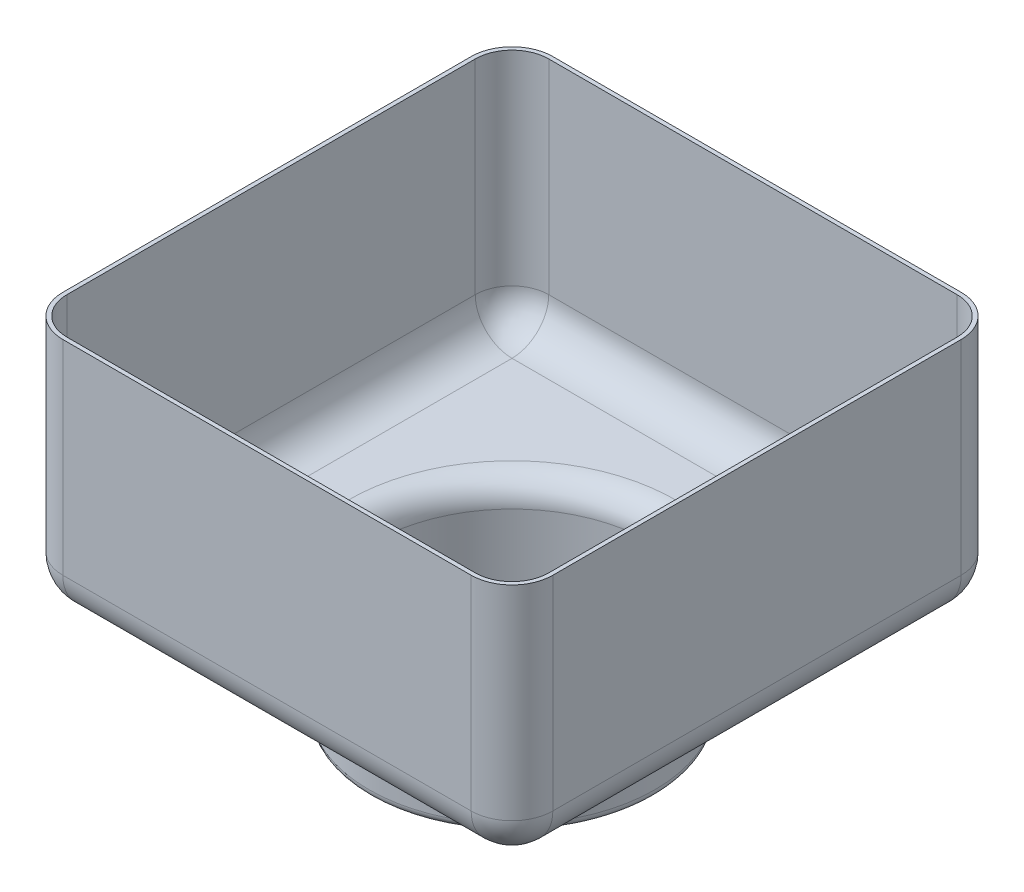
ISO-10303-21;
HEADER;
FILE_DESCRIPTION(('STEP AP214'),'2;1');
FILE_NAME('part.step','',(''),(''),'','','');
FILE_SCHEMA(('AUTOMOTIVE_DESIGN { 1 0 10303 214 1 1 1 1 }'));
ENDSEC;
DATA;
#1=APPLICATION_CONTEXT('core data for automotive mechanical design processes');
#2=APPLICATION_PROTOCOL_DEFINITION('international standard','automotive_design',2000,#1);
#3=PRODUCT_CONTEXT('',#1,'mechanical');
#4=PRODUCT('Part','Part','',(#3));
#5=PRODUCT_RELATED_PRODUCT_CATEGORY('part','',(#4));
#6=PRODUCT_DEFINITION_FORMATION('','',#4);
#7=PRODUCT_DEFINITION_CONTEXT('part definition',#1,'design');
#8=PRODUCT_DEFINITION('design','',#6,#7);
#9=PRODUCT_DEFINITION_SHAPE('','',#8);
#10=(LENGTH_UNIT() NAMED_UNIT(*) SI_UNIT(.MILLI.,.METRE.));
#11=(NAMED_UNIT(*) PLANE_ANGLE_UNIT() SI_UNIT($,.RADIAN.));
#12=(NAMED_UNIT(*) SI_UNIT($,.STERADIAN.) SOLID_ANGLE_UNIT());
#13=UNCERTAINTY_MEASURE_WITH_UNIT(LENGTH_MEASURE(1.E-05),#10,'distance_accuracy_value','');
#14=(GEOMETRIC_REPRESENTATION_CONTEXT(3) GLOBAL_UNCERTAINTY_ASSIGNED_CONTEXT((#13)) GLOBAL_UNIT_ASSIGNED_CONTEXT((#10,
#11,#12)) REPRESENTATION_CONTEXT('',''));
#15=CARTESIAN_POINT('',(0.,0.,0.));
#16=DIRECTION('',(0.,0.,1.));
#17=DIRECTION('',(1.,0.,0.));
#18=AXIS2_PLACEMENT_3D('',#15,#16,#17);
#19=CARTESIAN_POINT('',(-47.3492587282987,25.,4.92602728588064));
#20=DIRECTION('',(0.,-1.,0.));
#21=DIRECTION('',(0.,0.,-1.));
#22=AXIS2_PLACEMENT_3D('',#19,#20,#21);
#23=CYLINDRICAL_SURFACE('',#22,35.);
#24=CARTESIAN_POINT('',(-47.3492587282987,2.,4.92602728588064));
#25=DIRECTION('',(0.,1.,0.));
#26=DIRECTION('',(0.,0.,1.));
#27=AXIS2_PLACEMENT_3D('',#24,#25,#26);
#28=CIRCLE('',#27,35.);
#29=CARTESIAN_POINT('',(-47.3492587282987,2.,39.9260272858807));
#30=VERTEX_POINT('',#29);
#31=EDGE_CURVE('E43',#30,#30,#28,.T.);
#32=ORIENTED_EDGE('',*,*,#31,.T.);
#33=EDGE_LOOP('',(#32));
#34=FACE_BOUND('',#33,.T.);
#35=CARTESIAN_POINT('',(-47.3492587282987,20.,4.92602728588064));
#36=DIRECTION('',(0.,1.,0.));
#37=DIRECTION('',(0.,0.,1.));
#38=AXIS2_PLACEMENT_3D('',#35,#36,#37);
#39=CIRCLE('',#38,35.);
#40=CARTESIAN_POINT('',(-47.3492587282987,20.,39.9260272858807));
#41=VERTEX_POINT('',#40);
#42=EDGE_CURVE('E335',#41,#41,#39,.F.);
#43=ORIENTED_EDGE('',*,*,#42,.T.);
#44=EDGE_LOOP('',(#43));
#45=FACE_BOUND('',#44,.T.);
#46=ADVANCED_FACE('F35',(#34,#45),#23,.T.);
#47=CARTESIAN_POINT('',(0.,0.,0.));
#48=DIRECTION('',(0.,1.,0.));
#49=DIRECTION('',(0.,0.,1.));
#50=AXIS2_PLACEMENT_3D('',#47,#48,#49);
#51=PLANE('',#50);
#52=CARTESIAN_POINT('',(-47.3492587282987,0.,4.92602728588064));
#53=DIRECTION('',(0.,1.,0.));
#54=DIRECTION('',(0.,0.,1.));
#55=AXIS2_PLACEMENT_3D('',#52,#53,#54);
#56=CIRCLE('',#55,33.);
#57=CARTESIAN_POINT('',(-47.3492587282987,0.,37.9260272858806));
#58=VERTEX_POINT('',#57);
#59=EDGE_CURVE('E11',#58,#58,#56,.F.);
#60=ORIENTED_EDGE('',*,*,#59,.T.);
#61=EDGE_LOOP('',(#60));
#62=FACE_BOUND('',#61,.T.);
#63=ADVANCED_FACE('F357',(#62),#51,.F.);
#64=CARTESIAN_POINT('',(-97.3492587282987,85.,-45.0739727141194));
#65=DIRECTION('',(0.,-1.,0.));
#66=DIRECTION('',(0.,0.,-1.));
#67=AXIS2_PLACEMENT_3D('',#64,#65,#66);
#68=CYLINDRICAL_SURFACE('',#67,9.99999999999999);
#69=DIRECTION('',(0.,-1.,0.));
#70=VECTOR('',#69,1.);
#71=CARTESIAN_POINT('',(-97.3492587282986,85.,-55.0739727141194));
#72=LINE('',#71,#70);
#73=CARTESIAN_POINT('',(-97.3492587282986,85.,-55.0739727141194));
#74=VERTEX_POINT('',#73);
#75=CARTESIAN_POINT('',(-97.3492587282986,35.,-55.0739727141194));
#76=VERTEX_POINT('',#75);
#77=EDGE_CURVE('E264',#74,#76,#72,.T.);
#78=ORIENTED_EDGE('',*,*,#77,.T.);
#79=CARTESIAN_POINT('',(-97.3492587282987,35.,-45.0739727141194));
#80=DIRECTION('',(0.,-1.,0.));
#81=DIRECTION('',(0.,0.,-1.));
#82=AXIS2_PLACEMENT_3D('',#79,#80,#81);
#83=CIRCLE('',#82,9.99999999999999);
#84=CARTESIAN_POINT('',(-107.349258728299,35.,-45.0739727141193));
#85=VERTEX_POINT('',#84);
#86=EDGE_CURVE('E304',#76,#85,#83,.F.);
#87=ORIENTED_EDGE('',*,*,#86,.T.);
#88=DIRECTION('',(0.,-1.,0.));
#89=VECTOR('',#88,1.);
#90=CARTESIAN_POINT('',(-107.349258728299,85.,-45.0739727141193));
#91=LINE('',#90,#89);
#92=CARTESIAN_POINT('',(-107.349258728299,85.,-45.0739727141193));
#93=VERTEX_POINT('',#92);
#94=EDGE_CURVE('E283',#93,#85,#91,.T.);
#95=ORIENTED_EDGE('',*,*,#94,.F.);
#96=CARTESIAN_POINT('',(-97.3492587282987,85.,-45.0739727141194));
#97=DIRECTION('',(0.,1.,0.));
#98=DIRECTION('',(0.,0.,1.));
#99=AXIS2_PLACEMENT_3D('',#96,#97,#98);
#100=CIRCLE('',#99,9.99999999999999);
#101=EDGE_CURVE('E246',#74,#93,#100,.T.);
#102=ORIENTED_EDGE('',*,*,#101,.F.);
#103=EDGE_LOOP('',(#78,#87,#95,#102));
#104=FACE_BOUND('',#103,.T.);
#105=ADVANCED_FACE('F362',(#104),#68,.T.);
#106=CARTESIAN_POINT('',(-107.349258728299,85.,-45.0739727141193));
#107=DIRECTION('',(1.,0.,0.));
#108=DIRECTION('',(0.,0.,-1.));
#109=AXIS2_PLACEMENT_3D('',#106,#107,#108);
#110=PLANE('',#109);
#111=ORIENTED_EDGE('',*,*,#94,.T.);
#112=DIRECTION('',(0.,0.,1.));
#113=VECTOR('',#112,1.);
#114=CARTESIAN_POINT('',(-107.349258728299,35.,-45.0739727141193));
#115=LINE('',#114,#113);
#116=CARTESIAN_POINT('',(-107.349258728299,35.,54.9260272858806));
#117=VERTEX_POINT('',#116);
#118=EDGE_CURVE('E306',#85,#117,#115,.T.);
#119=ORIENTED_EDGE('',*,*,#118,.T.);
#120=DIRECTION('',(0.,-1.,0.));
#121=VECTOR('',#120,1.);
#122=CARTESIAN_POINT('',(-107.349258728299,85.,54.9260272858806));
#123=LINE('',#122,#121);
#124=CARTESIAN_POINT('',(-107.349258728299,85.,54.9260272858806));
#125=VERTEX_POINT('',#124);
#126=EDGE_CURVE('E280',#125,#117,#123,.T.);
#127=ORIENTED_EDGE('',*,*,#126,.F.);
#128=DIRECTION('',(0.,0.,1.));
#129=VECTOR('',#128,1.);
#130=CARTESIAN_POINT('',(-107.349258728299,85.,-45.0739727141193));
#131=LINE('',#130,#129);
#132=EDGE_CURVE('E249',#93,#125,#131,.T.);
#133=ORIENTED_EDGE('',*,*,#132,.F.);
#134=EDGE_LOOP('',(#111,#119,#127,#133));
#135=FACE_BOUND('',#134,.T.);
#136=ADVANCED_FACE('F449',(#135),#110,.F.);
#137=CARTESIAN_POINT('',(-97.3492587282987,85.,54.9260272858806));
#138=DIRECTION('',(0.,-1.,0.));
#139=DIRECTION('',(0.,0.,-1.));
#140=AXIS2_PLACEMENT_3D('',#137,#138,#139);
#141=CYLINDRICAL_SURFACE('',#140,9.99999999999999);
#142=ORIENTED_EDGE('',*,*,#126,.T.);
#143=CARTESIAN_POINT('',(-97.3492587282987,35.,54.9260272858806));
#144=DIRECTION('',(0.,-1.,0.));
#145=DIRECTION('',(0.,0.,-1.));
#146=AXIS2_PLACEMENT_3D('',#143,#144,#145);
#147=CIRCLE('',#146,9.99999999999999);
#148=CARTESIAN_POINT('',(-97.3492587282986,35.,64.9260272858806));
#149=VERTEX_POINT('',#148);
#150=EDGE_CURVE('E302',#117,#149,#147,.F.);
#151=ORIENTED_EDGE('',*,*,#150,.T.);
#152=DIRECTION('',(0.,-1.,0.));
#153=VECTOR('',#152,1.);
#154=CARTESIAN_POINT('',(-97.3492587282986,85.,64.9260272858806));
#155=LINE('',#154,#153);
#156=CARTESIAN_POINT('',(-97.3492587282986,85.,64.9260272858806));
#157=VERTEX_POINT('',#156);
#158=EDGE_CURVE('E277',#157,#149,#155,.T.);
#159=ORIENTED_EDGE('',*,*,#158,.F.);
#160=CARTESIAN_POINT('',(-97.3492587282987,85.,54.9260272858806));
#161=DIRECTION('',(0.,1.,0.));
#162=DIRECTION('',(0.,0.,1.));
#163=AXIS2_PLACEMENT_3D('',#160,#161,#162);
#164=CIRCLE('',#163,9.99999999999999);
#165=EDGE_CURVE('E252',#125,#157,#164,.T.);
#166=ORIENTED_EDGE('',*,*,#165,.F.);
#167=EDGE_LOOP('',(#142,#151,#159,#166));
#168=FACE_BOUND('',#167,.T.);
#169=ADVANCED_FACE('F446',(#168),#141,.T.);
#170=CARTESIAN_POINT('',(-97.3492587282986,85.,64.9260272858806));
#171=DIRECTION('',(0.,0.,-1.));
#172=DIRECTION('',(-1.,0.,0.));
#173=AXIS2_PLACEMENT_3D('',#170,#171,#172);
#174=PLANE('',#173);
#175=ORIENTED_EDGE('',*,*,#158,.T.);
#176=DIRECTION('',(1.,0.,0.));
#177=VECTOR('',#176,1.);
#178=CARTESIAN_POINT('',(-97.3492587282986,35.,64.9260272858806));
#179=LINE('',#178,#177);
#180=CARTESIAN_POINT('',(2.65074127170125,35.,64.9260272858807));
#181=VERTEX_POINT('',#180);
#182=EDGE_CURVE('E291',#149,#181,#179,.T.);
#183=ORIENTED_EDGE('',*,*,#182,.T.);
#184=DIRECTION('',(0.,-1.,0.));
#185=VECTOR('',#184,1.);
#186=CARTESIAN_POINT('',(2.65074127170125,85.,64.9260272858807));
#187=LINE('',#186,#185);
#188=CARTESIAN_POINT('',(2.65074127170125,85.,64.9260272858807));
#189=VERTEX_POINT('',#188);
#190=EDGE_CURVE('E274',#189,#181,#187,.T.);
#191=ORIENTED_EDGE('',*,*,#190,.F.);
#192=DIRECTION('',(1.,0.,0.));
#193=VECTOR('',#192,1.);
#194=CARTESIAN_POINT('',(-97.3492587282986,85.,64.9260272858806));
#195=LINE('',#194,#193);
#196=EDGE_CURVE('E254',#157,#189,#195,.T.);
#197=ORIENTED_EDGE('',*,*,#196,.F.);
#198=EDGE_LOOP('',(#175,#183,#191,#197));
#199=FACE_BOUND('',#198,.T.);
#200=ADVANCED_FACE('F442',(#199),#174,.F.);
#201=CARTESIAN_POINT('',(2.65074127170132,85.,54.9260272858807));
#202=DIRECTION('',(0.,-1.,0.));
#203=DIRECTION('',(0.,0.,-1.));
#204=AXIS2_PLACEMENT_3D('',#201,#202,#203);
#205=CYLINDRICAL_SURFACE('',#204,10.);
#206=ORIENTED_EDGE('',*,*,#190,.T.);
#207=CARTESIAN_POINT('',(2.65074127170132,35.,54.9260272858807));
#208=DIRECTION('',(0.,-1.,0.));
#209=DIRECTION('',(0.,0.,-1.));
#210=AXIS2_PLACEMENT_3D('',#207,#208,#209);
#211=CIRCLE('',#210,10.);
#212=CARTESIAN_POINT('',(12.6507412717013,35.,54.9260272858806));
#213=VERTEX_POINT('',#212);
#214=EDGE_CURVE('E289',#181,#213,#211,.F.);
#215=ORIENTED_EDGE('',*,*,#214,.T.);
#216=DIRECTION('',(0.,-1.,0.));
#217=VECTOR('',#216,1.);
#218=CARTESIAN_POINT('',(12.6507412717013,85.,54.9260272858806));
#219=LINE('',#218,#217);
#220=CARTESIAN_POINT('',(12.6507412717013,85.,54.9260272858806));
#221=VERTEX_POINT('',#220);
#222=EDGE_CURVE('E271',#221,#213,#219,.T.);
#223=ORIENTED_EDGE('',*,*,#222,.F.);
#224=CARTESIAN_POINT('',(2.65074127170132,85.,54.9260272858807));
#225=DIRECTION('',(0.,1.,0.));
#226=DIRECTION('',(0.,0.,1.));
#227=AXIS2_PLACEMENT_3D('',#224,#225,#226);
#228=CIRCLE('',#227,10.);
#229=EDGE_CURVE('E256',#189,#221,#228,.T.);
#230=ORIENTED_EDGE('',*,*,#229,.F.);
#231=EDGE_LOOP('',(#206,#215,#223,#230));
#232=FACE_BOUND('',#231,.T.);
#233=ADVANCED_FACE('F438',(#232),#205,.T.);
#234=CARTESIAN_POINT('',(12.6507412717013,85.,-45.0739727141193));
#235=DIRECTION('',(-1.,0.,0.));
#236=DIRECTION('',(0.,0.,1.));
#237=AXIS2_PLACEMENT_3D('',#234,#235,#236);
#238=PLANE('',#237);
#239=ORIENTED_EDGE('',*,*,#222,.T.);
#240=DIRECTION('',(0.,0.,-1.));
#241=VECTOR('',#240,1.);
#242=CARTESIAN_POINT('',(12.6507412717013,35.,-45.0739727141193));
#243=LINE('',#242,#241);
#244=CARTESIAN_POINT('',(12.6507412717013,35.,-45.0739727141193));
#245=VERTEX_POINT('',#244);
#246=EDGE_CURVE('E308',#213,#245,#243,.T.);
#247=ORIENTED_EDGE('',*,*,#246,.T.);
#248=DIRECTION('',(0.,-1.,0.));
#249=VECTOR('',#248,1.);
#250=CARTESIAN_POINT('',(12.6507412717013,85.,-45.0739727141193));
#251=LINE('',#250,#249);
#252=CARTESIAN_POINT('',(12.6507412717013,85.,-45.0739727141193));
#253=VERTEX_POINT('',#252);
#254=EDGE_CURVE('E268',#253,#245,#251,.T.);
#255=ORIENTED_EDGE('',*,*,#254,.F.);
#256=DIRECTION('',(0.,0.,-1.));
#257=VECTOR('',#256,1.);
#258=CARTESIAN_POINT('',(12.6507412717013,85.,-45.0739727141193));
#259=LINE('',#258,#257);
#260=EDGE_CURVE('E258',#221,#253,#259,.T.);
#261=ORIENTED_EDGE('',*,*,#260,.F.);
#262=EDGE_LOOP('',(#239,#247,#255,#261));
#263=FACE_BOUND('',#262,.T.);
#264=ADVANCED_FACE('F435',(#263),#238,.F.);
#265=CARTESIAN_POINT('',(2.65074127170131,85.,-45.0739727141194));
#266=DIRECTION('',(0.,-1.,0.));
#267=DIRECTION('',(0.,0.,-1.));
#268=AXIS2_PLACEMENT_3D('',#265,#266,#267);
#269=CYLINDRICAL_SURFACE('',#268,10.);
#270=ORIENTED_EDGE('',*,*,#254,.T.);
#271=CARTESIAN_POINT('',(2.65074127170131,35.,-45.0739727141194));
#272=DIRECTION('',(0.,-1.,0.));
#273=DIRECTION('',(0.,0.,-1.));
#274=AXIS2_PLACEMENT_3D('',#271,#272,#273);
#275=CIRCLE('',#274,10.);
#276=CARTESIAN_POINT('',(2.65074127170124,35.,-55.0739727141194));
#277=VERTEX_POINT('',#276);
#278=EDGE_CURVE('E286',#245,#277,#275,.F.);
#279=ORIENTED_EDGE('',*,*,#278,.T.);
#280=DIRECTION('',(0.,-1.,0.));
#281=VECTOR('',#280,1.);
#282=CARTESIAN_POINT('',(2.65074127170124,85.,-55.0739727141194));
#283=LINE('',#282,#281);
#284=CARTESIAN_POINT('',(2.65074127170124,85.,-55.0739727141194));
#285=VERTEX_POINT('',#284);
#286=EDGE_CURVE('E266',#285,#277,#283,.T.);
#287=ORIENTED_EDGE('',*,*,#286,.F.);
#288=CARTESIAN_POINT('',(2.65074127170131,85.,-45.0739727141194));
#289=DIRECTION('',(0.,1.,0.));
#290=DIRECTION('',(0.,0.,-1.));
#291=AXIS2_PLACEMENT_3D('',#288,#289,#290);
#292=CIRCLE('',#291,10.);
#293=EDGE_CURVE('E260',#253,#285,#292,.T.);
#294=ORIENTED_EDGE('',*,*,#293,.F.);
#295=EDGE_LOOP('',(#270,#279,#287,#294));
#296=FACE_BOUND('',#295,.T.);
#297=ADVANCED_FACE('F423',(#296),#269,.T.);
#298=CARTESIAN_POINT('',(-97.3492587282986,85.,-55.0739727141194));
#299=DIRECTION('',(0.,0.,1.));
#300=DIRECTION('',(1.,0.,0.));
#301=AXIS2_PLACEMENT_3D('',#298,#299,#300);
#302=PLANE('',#301);
#303=ORIENTED_EDGE('',*,*,#286,.T.);
#304=DIRECTION('',(-1.,0.,0.));
#305=VECTOR('',#304,1.);
#306=CARTESIAN_POINT('',(-97.3492587282986,35.,-55.0739727141194));
#307=LINE('',#306,#305);
#308=EDGE_CURVE('E58',#277,#76,#307,.T.);
#309=ORIENTED_EDGE('',*,*,#308,.T.);
#310=ORIENTED_EDGE('',*,*,#77,.F.);
#311=DIRECTION('',(-1.,0.,0.));
#312=VECTOR('',#311,1.);
#313=CARTESIAN_POINT('',(-97.3492587282986,85.,-55.0739727141194));
#314=LINE('',#313,#312);
#315=EDGE_CURVE('E262',#285,#74,#314,.T.);
#316=ORIENTED_EDGE('',*,*,#315,.F.);
#317=EDGE_LOOP('',(#303,#309,#310,#316));
#318=FACE_BOUND('',#317,.T.);
#319=ADVANCED_FACE('F427',(#318),#302,.F.);
#320=CARTESIAN_POINT('',(-97.3492587282987,85.,-45.0739727141194));
#321=DIRECTION('',(0.,1.,0.));
#322=DIRECTION('',(0.,0.,1.));
#323=AXIS2_PLACEMENT_3D('',#320,#321,#322);
#324=PLANE('',#323);
#325=CARTESIAN_POINT('',(-97.3492587282987,85.,-45.0739727141194));
#326=DIRECTION('',(0.,1.,0.));
#327=DIRECTION('',(0.,0.,1.));
#328=AXIS2_PLACEMENT_3D('',#325,#326,#327);
#329=CIRCLE('',#328,8.99999999999999);
#330=CARTESIAN_POINT('',(-97.3492587282986,85.,-54.0739727141194));
#331=VERTEX_POINT('',#330);
#332=CARTESIAN_POINT('',(-106.349258728299,85.,-45.0739727141193));
#333=VERTEX_POINT('',#332);
#334=EDGE_CURVE('E231',#331,#333,#329,.T.);
#335=ORIENTED_EDGE('',*,*,#334,.F.);
#336=DIRECTION('',(-1.,0.,0.));
#337=VECTOR('',#336,1.);
#338=CARTESIAN_POINT('',(-97.3492587282986,85.,-54.0739727141194));
#339=LINE('',#338,#337);
#340=CARTESIAN_POINT('',(2.65074127170124,85.,-54.0739727141194));
#341=VERTEX_POINT('',#340);
#342=EDGE_CURVE('E241',#341,#331,#339,.T.);
#343=ORIENTED_EDGE('',*,*,#342,.F.);
#344=CARTESIAN_POINT('',(2.65074127170131,85.,-45.0739727141194));
#345=DIRECTION('',(0.,1.,0.));
#346=DIRECTION('',(0.,0.,1.));
#347=AXIS2_PLACEMENT_3D('',#344,#345,#346);
#348=CIRCLE('',#347,9.);
#349=CARTESIAN_POINT('',(11.6507412717013,85.,-45.0739727141193));
#350=VERTEX_POINT('',#349);
#351=EDGE_CURVE('E239',#350,#341,#348,.T.);
#352=ORIENTED_EDGE('',*,*,#351,.F.);
#353=DIRECTION('',(0.,0.,-1.));
#354=VECTOR('',#353,1.);
#355=CARTESIAN_POINT('',(11.6507412717013,85.,-45.0739727141193));
#356=LINE('',#355,#354);
#357=CARTESIAN_POINT('',(11.6507412717013,85.,54.9260272858806));
#358=VERTEX_POINT('',#357);
#359=EDGE_CURVE('E237',#358,#350,#356,.T.);
#360=ORIENTED_EDGE('',*,*,#359,.F.);
#361=CARTESIAN_POINT('',(2.65074127170132,85.,54.9260272858807));
#362=DIRECTION('',(0.,1.,0.));
#363=DIRECTION('',(0.,0.,1.));
#364=AXIS2_PLACEMENT_3D('',#361,#362,#363);
#365=CIRCLE('',#364,9.);
#366=CARTESIAN_POINT('',(2.65074127170126,85.,63.9260272858807));
#367=VERTEX_POINT('',#366);
#368=EDGE_CURVE('E235',#367,#358,#365,.T.);
#369=ORIENTED_EDGE('',*,*,#368,.F.);
#370=DIRECTION('',(1.,0.,0.));
#371=VECTOR('',#370,1.);
#372=CARTESIAN_POINT('',(-97.3492587282986,85.,63.9260272858806));
#373=LINE('',#372,#371);
#374=CARTESIAN_POINT('',(-97.3492587282986,85.,63.9260272858806));
#375=VERTEX_POINT('',#374);
#376=EDGE_CURVE('E233',#375,#367,#373,.T.);
#377=ORIENTED_EDGE('',*,*,#376,.F.);
#378=CARTESIAN_POINT('',(-97.3492587282987,85.,54.9260272858806));
#379=DIRECTION('',(0.,1.,0.));
#380=DIRECTION('',(0.,0.,1.));
#381=AXIS2_PLACEMENT_3D('',#378,#379,#380);
#382=CIRCLE('',#381,8.99999999999999);
#383=CARTESIAN_POINT('',(-106.349258728299,85.,54.9260272858806));
#384=VERTEX_POINT('',#383);
#385=EDGE_CURVE('E230',#384,#375,#382,.T.);
#386=ORIENTED_EDGE('',*,*,#385,.F.);
#387=DIRECTION('',(0.,0.,1.));
#388=VECTOR('',#387,1.);
#389=CARTESIAN_POINT('',(-106.349258728299,85.,-45.0739727141193));
#390=LINE('',#389,#388);
#391=EDGE_CURVE('E228',#333,#384,#390,.T.);
#392=ORIENTED_EDGE('',*,*,#391,.F.);
#393=EDGE_LOOP('',(#335,#343,#352,#360,#369,#377,#386,#392));
#394=FACE_BOUND('',#393,.T.);
#395=ORIENTED_EDGE('',*,*,#101,.T.);
#396=ORIENTED_EDGE('',*,*,#132,.T.);
#397=ORIENTED_EDGE('',*,*,#165,.T.);
#398=ORIENTED_EDGE('',*,*,#196,.T.);
#399=ORIENTED_EDGE('',*,*,#229,.T.);
#400=ORIENTED_EDGE('',*,*,#260,.T.);
#401=ORIENTED_EDGE('',*,*,#293,.T.);
#402=ORIENTED_EDGE('',*,*,#315,.T.);
#403=EDGE_LOOP('',(#395,#396,#397,#398,#399,#400,#401,#402));
#404=FACE_BOUND('',#403,.T.);
#405=ADVANCED_FACE('F401',(#394,#404),#324,.T.);
#406=CARTESIAN_POINT('',(-97.3492587282987,25.,-45.0739727141194));
#407=DIRECTION('',(0.,1.,0.));
#408=DIRECTION('',(0.,0.,1.));
#409=AXIS2_PLACEMENT_3D('',#406,#407,#408);
#410=PLANE('',#409);
#411=CARTESIAN_POINT('',(-47.3492587282987,25.,4.92602728588064));
#412=DIRECTION('',(0.,1.,0.));
#413=DIRECTION('',(0.,0.,1.));
#414=AXIS2_PLACEMENT_3D('',#411,#412,#413);
#415=CIRCLE('',#414,40.);
#416=CARTESIAN_POINT('',(-47.3492587282987,25.,44.9260272858806));
#417=VERTEX_POINT('',#416);
#418=EDGE_CURVE('E311',#417,#417,#415,.T.);
#419=ORIENTED_EDGE('',*,*,#418,.T.);
#420=EDGE_LOOP('',(#419));
#421=FACE_BOUND('',#420,.T.);
#422=DIRECTION('',(0.,0.,-1.));
#423=VECTOR('',#422,1.);
#424=CARTESIAN_POINT('',(2.6507412717013,25.,-45.0739727141194));
#425=LINE('',#424,#423);
#426=CARTESIAN_POINT('',(2.65074127170131,25.,-45.0739727141194));
#427=VERTEX_POINT('',#426);
#428=CARTESIAN_POINT('',(2.65074127170132,25.,54.9260272858807));
#429=VERTEX_POINT('',#428);
#430=EDGE_CURVE('E295',#427,#429,#425,.F.);
#431=ORIENTED_EDGE('',*,*,#430,.T.);
#432=DIRECTION('',(1.,0.,0.));
#433=VECTOR('',#432,1.);
#434=CARTESIAN_POINT('',(-97.3492587282987,25.,54.9260272858806));
#435=LINE('',#434,#433);
#436=CARTESIAN_POINT('',(-97.3492587282987,25.,54.9260272858806));
#437=VERTEX_POINT('',#436);
#438=EDGE_CURVE('E299',#429,#437,#435,.F.);
#439=ORIENTED_EDGE('',*,*,#438,.T.);
#440=DIRECTION('',(0.,0.,1.));
#441=VECTOR('',#440,1.);
#442=CARTESIAN_POINT('',(-97.3492587282987,25.,-45.0739727141194));
#443=LINE('',#442,#441);
#444=CARTESIAN_POINT('',(-97.3492587282987,25.,-45.0739727141194));
#445=VERTEX_POINT('',#444);
#446=EDGE_CURVE('E297',#437,#445,#443,.F.);
#447=ORIENTED_EDGE('',*,*,#446,.T.);
#448=DIRECTION('',(-1.,0.,0.));
#449=VECTOR('',#448,1.);
#450=CARTESIAN_POINT('',(-97.3492587282987,25.,-45.0739727141194));
#451=LINE('',#450,#449);
#452=EDGE_CURVE('E293',#445,#427,#451,.F.);
#453=ORIENTED_EDGE('',*,*,#452,.T.);
#454=EDGE_LOOP('',(#431,#439,#447,#453));
#455=FACE_BOUND('',#454,.T.);
#456=ADVANCED_FACE('F396',(#421,#455),#410,.F.);
#457=CARTESIAN_POINT('',(-97.3492587282987,35.,54.9260272858806));
#458=DIRECTION('',(0.,1.,0.));
#459=DIRECTION('',(0.,0.,1.));
#460=AXIS2_PLACEMENT_3D('',#457,#458,#459);
#461=SPHERICAL_SURFACE('',#460,10.);
#462=CARTESIAN_POINT('',(-97.3492587282987,35.,54.9260272858806));
#463=DIRECTION('',(0.,0.,-1.));
#464=DIRECTION('',(-1.,0.,0.));
#465=AXIS2_PLACEMENT_3D('',#462,#463,#464);
#466=CIRCLE('',#465,10.);
#467=EDGE_CURVE('E328',#437,#117,#466,.T.);
#468=ORIENTED_EDGE('',*,*,#467,.F.);
#469=CARTESIAN_POINT('',(-97.3492587282987,35.,54.9260272858806));
#470=DIRECTION('',(1.,0.,0.));
#471=DIRECTION('',(0.,0.,-1.));
#472=AXIS2_PLACEMENT_3D('',#469,#470,#471);
#473=CIRCLE('',#472,10.);
#474=EDGE_CURVE('E250',#149,#437,#473,.T.);
#475=ORIENTED_EDGE('',*,*,#474,.F.);
#476=ORIENTED_EDGE('',*,*,#150,.F.);
#477=EDGE_LOOP('',(#468,#475,#476));
#478=FACE_BOUND('',#477,.T.);
#479=ADVANCED_FACE('F393',(#478),#461,.T.);
#480=CARTESIAN_POINT('',(-97.3492587282986,35.,54.9260272858806));
#481=DIRECTION('',(1.,0.,0.));
#482=DIRECTION('',(0.,0.,-1.));
#483=AXIS2_PLACEMENT_3D('',#480,#481,#482);
#484=CYLINDRICAL_SURFACE('',#483,10.);
#485=ORIENTED_EDGE('',*,*,#474,.T.);
#486=ORIENTED_EDGE('',*,*,#438,.F.);
#487=CARTESIAN_POINT('',(2.65074127170125,35.,54.9260272858807));
#488=DIRECTION('',(1.,0.,0.));
#489=DIRECTION('',(0.,1.,0.));
#490=AXIS2_PLACEMENT_3D('',#487,#488,#489);
#491=CIRCLE('',#490,10.);
#492=EDGE_CURVE('E325',#181,#429,#491,.T.);
#493=ORIENTED_EDGE('',*,*,#492,.F.);
#494=ORIENTED_EDGE('',*,*,#182,.F.);
#495=EDGE_LOOP('',(#485,#486,#493,#494));
#496=FACE_BOUND('',#495,.T.);
#497=ADVANCED_FACE('F389',(#496),#484,.T.);
#498=CARTESIAN_POINT('',(-97.3492587282987,35.,-45.0739727141193));
#499=DIRECTION('',(0.,0.,1.));
#500=DIRECTION('',(1.,0.,0.));
#501=AXIS2_PLACEMENT_3D('',#498,#499,#500);
#502=CYLINDRICAL_SURFACE('',#501,10.);
#503=ORIENTED_EDGE('',*,*,#467,.T.);
#504=ORIENTED_EDGE('',*,*,#118,.F.);
#505=CARTESIAN_POINT('',(-97.3492587282987,35.,-45.0739727141194));
#506=DIRECTION('',(0.,0.,-1.));
#507=DIRECTION('',(-1.,0.,0.));
#508=AXIS2_PLACEMENT_3D('',#505,#506,#507);
#509=CIRCLE('',#508,10.);
#510=EDGE_CURVE('E322',#445,#85,#509,.T.);
#511=ORIENTED_EDGE('',*,*,#510,.F.);
#512=ORIENTED_EDGE('',*,*,#446,.F.);
#513=EDGE_LOOP('',(#503,#504,#511,#512));
#514=FACE_BOUND('',#513,.T.);
#515=ADVANCED_FACE('F385',(#514),#502,.T.);
#516=CARTESIAN_POINT('',(2.65074127170132,35.,54.9260272858807));
#517=DIRECTION('',(0.,1.,0.));
#518=DIRECTION('',(0.,0.,1.));
#519=AXIS2_PLACEMENT_3D('',#516,#517,#518);
#520=SPHERICAL_SURFACE('',#519,10.);
#521=ORIENTED_EDGE('',*,*,#214,.F.);
#522=ORIENTED_EDGE('',*,*,#492,.T.);
#523=CARTESIAN_POINT('',(2.65074127170132,35.,54.9260272858807));
#524=DIRECTION('',(0.,0.,-1.));
#525=DIRECTION('',(-1.,0.,0.));
#526=AXIS2_PLACEMENT_3D('',#523,#524,#525);
#527=CIRCLE('',#526,10.);
#528=EDGE_CURVE('E319',#213,#429,#527,.T.);
#529=ORIENTED_EDGE('',*,*,#528,.F.);
#530=EDGE_LOOP('',(#521,#522,#529));
#531=FACE_BOUND('',#530,.T.);
#532=ADVANCED_FACE('F381',(#531),#520,.T.);
#533=CARTESIAN_POINT('',(-97.3492587282987,35.,-45.0739727141194));
#534=DIRECTION('',(0.,1.,0.));
#535=DIRECTION('',(0.,0.,1.));
#536=AXIS2_PLACEMENT_3D('',#533,#534,#535);
#537=SPHERICAL_SURFACE('',#536,10.);
#538=ORIENTED_EDGE('',*,*,#510,.T.);
#539=ORIENTED_EDGE('',*,*,#86,.F.);
#540=CARTESIAN_POINT('',(-97.3492587282987,35.,-45.0739727141194));
#541=DIRECTION('',(1.,0.,0.));
#542=DIRECTION('',(0.,0.,-1.));
#543=AXIS2_PLACEMENT_3D('',#540,#541,#542);
#544=CIRCLE('',#543,10.);
#545=EDGE_CURVE('E316',#445,#76,#544,.T.);
#546=ORIENTED_EDGE('',*,*,#545,.F.);
#547=EDGE_LOOP('',(#538,#539,#546));
#548=FACE_BOUND('',#547,.T.);
#549=ADVANCED_FACE('F377',(#548),#537,.T.);
#550=CARTESIAN_POINT('',(2.65074127170131,35.,-45.0739727141193));
#551=DIRECTION('',(0.,0.,-1.));
#552=DIRECTION('',(-1.,0.,0.));
#553=AXIS2_PLACEMENT_3D('',#550,#551,#552);
#554=CYLINDRICAL_SURFACE('',#553,10.);
#555=ORIENTED_EDGE('',*,*,#528,.T.);
#556=ORIENTED_EDGE('',*,*,#430,.F.);
#557=CARTESIAN_POINT('',(2.65074127170131,35.,-45.0739727141193));
#558=DIRECTION('',(0.,0.,-1.));
#559=DIRECTION('',(0.,1.,0.));
#560=AXIS2_PLACEMENT_3D('',#557,#558,#559);
#561=CIRCLE('',#560,10.);
#562=EDGE_CURVE('E313',#245,#427,#561,.T.);
#563=ORIENTED_EDGE('',*,*,#562,.F.);
#564=ORIENTED_EDGE('',*,*,#246,.F.);
#565=EDGE_LOOP('',(#555,#556,#563,#564));
#566=FACE_BOUND('',#565,.T.);
#567=ADVANCED_FACE('F373',(#566),#554,.T.);
#568=CARTESIAN_POINT('',(-97.3492587282986,35.,-45.0739727141194));
#569=DIRECTION('',(-1.,0.,0.));
#570=DIRECTION('',(0.,0.,1.));
#571=AXIS2_PLACEMENT_3D('',#568,#569,#570);
#572=CYLINDRICAL_SURFACE('',#571,10.);
#573=ORIENTED_EDGE('',*,*,#545,.T.);
#574=ORIENTED_EDGE('',*,*,#308,.F.);
#575=CARTESIAN_POINT('',(2.65074127170131,35.,-45.0739727141194));
#576=DIRECTION('',(1.,0.,0.));
#577=DIRECTION('',(0.,0.,-1.));
#578=AXIS2_PLACEMENT_3D('',#575,#576,#577);
#579=CIRCLE('',#578,10.);
#580=EDGE_CURVE('E226',#427,#277,#579,.T.);
#581=ORIENTED_EDGE('',*,*,#580,.F.);
#582=ORIENTED_EDGE('',*,*,#452,.F.);
#583=EDGE_LOOP('',(#573,#574,#581,#582));
#584=FACE_BOUND('',#583,.T.);
#585=ADVANCED_FACE('F369',(#584),#572,.T.);
#586=CARTESIAN_POINT('',(2.65074127170131,35.,-45.0739727141194));
#587=DIRECTION('',(0.,1.,0.));
#588=DIRECTION('',(0.,0.,1.));
#589=AXIS2_PLACEMENT_3D('',#586,#587,#588);
#590=SPHERICAL_SURFACE('',#589,10.);
#591=ORIENTED_EDGE('',*,*,#278,.F.);
#592=ORIENTED_EDGE('',*,*,#562,.T.);
#593=ORIENTED_EDGE('',*,*,#580,.T.);
#594=EDGE_LOOP('',(#591,#592,#593));
#595=FACE_BOUND('',#594,.T.);
#596=ADVANCED_FACE('F353',(#595),#590,.T.);
#597=CARTESIAN_POINT('',(-47.3492587282987,20.,4.92602728588064));
#598=DIRECTION('',(0.,1.,0.));
#599=DIRECTION('',(0.,0.,1.));
#600=AXIS2_PLACEMENT_3D('',#597,#598,#599);
#601=TOROIDAL_SURFACE('',#600,40.,5.);
#602=ORIENTED_EDGE('',*,*,#42,.F.);
#603=EDGE_LOOP('',(#602));
#604=FACE_BOUND('',#603,.T.);
#605=ORIENTED_EDGE('',*,*,#418,.F.);
#606=EDGE_LOOP('',(#605));
#607=FACE_BOUND('',#606,.T.);
#608=ADVANCED_FACE('F344',(#604,#607),#601,.F.);
#609=CARTESIAN_POINT('',(-47.3492587282987,2.,4.92602728588064));
#610=DIRECTION('',(0.,1.,0.));
#611=DIRECTION('',(0.,0.,1.));
#612=AXIS2_PLACEMENT_3D('',#609,#610,#611);
#613=TOROIDAL_SURFACE('',#612,33.,2.);
#614=ORIENTED_EDGE('',*,*,#59,.F.);
#615=EDGE_LOOP('',(#614));
#616=FACE_BOUND('',#615,.T.);
#617=ORIENTED_EDGE('',*,*,#31,.F.);
#618=EDGE_LOOP('',(#617));
#619=FACE_BOUND('',#618,.T.);
#620=ADVANCED_FACE('F37',(#616,#619),#613,.T.);
#621=CARTESIAN_POINT('',(-47.3492587282987,25.,4.92602728588064));
#622=DIRECTION('',(0.,-1.,0.));
#623=DIRECTION('',(0.,0.,-1.));
#624=AXIS2_PLACEMENT_3D('',#621,#622,#623);
#625=CYLINDRICAL_SURFACE('',#624,34.);
#626=CARTESIAN_POINT('',(-47.3492587282987,2.,4.92602728588064));
#627=DIRECTION('',(0.,-1.,0.));
#628=DIRECTION('',(0.,0.,-1.));
#629=AXIS2_PLACEMENT_3D('',#626,#627,#628);
#630=CIRCLE('',#629,34.);
#631=CARTESIAN_POINT('',(-47.3492587282987,2.,-29.0739727141194));
#632=VERTEX_POINT('',#631);
#633=EDGE_CURVE('E227',#632,#632,#630,.F.);
#634=ORIENTED_EDGE('',*,*,#633,.F.);
#635=EDGE_LOOP('',(#634));
#636=FACE_BOUND('',#635,.T.);
#637=CARTESIAN_POINT('',(-47.3492587282987,20.,4.92602728588064));
#638=DIRECTION('',(0.,-1.,0.));
#639=DIRECTION('',(0.,0.,-1.));
#640=AXIS2_PLACEMENT_3D('',#637,#638,#639);
#641=CIRCLE('',#640,34.);
#642=CARTESIAN_POINT('',(-47.3492587282987,20.,-29.0739727141194));
#643=VERTEX_POINT('',#642);
#644=EDGE_CURVE('E549',#643,#643,#641,.T.);
#645=ORIENTED_EDGE('',*,*,#644,.F.);
#646=EDGE_LOOP('',(#645));
#647=FACE_BOUND('',#646,.T.);
#648=ADVANCED_FACE('F343',(#636,#647),#625,.F.);
#649=CARTESIAN_POINT('',(0.,1.,0.));
#650=DIRECTION('',(0.,1.,0.));
#651=DIRECTION('',(0.,0.,1.));
#652=AXIS2_PLACEMENT_3D('',#649,#650,#651);
#653=PLANE('',#652);
#654=CARTESIAN_POINT('',(-47.3492587282987,1.,4.92602728588064));
#655=DIRECTION('',(0.,1.,0.));
#656=DIRECTION('',(0.,0.,1.));
#657=AXIS2_PLACEMENT_3D('',#654,#655,#656);
#658=CIRCLE('',#657,33.);
#659=CARTESIAN_POINT('',(-47.3492587282987,1.,37.9260272858806));
#660=VERTEX_POINT('',#659);
#661=EDGE_CURVE('E223',#660,#660,#658,.F.);
#662=ORIENTED_EDGE('',*,*,#661,.F.);
#663=EDGE_LOOP('',(#662));
#664=FACE_BOUND('',#663,.T.);
#665=ADVANCED_FACE('F350',(#664),#653,.T.);
#666=CARTESIAN_POINT('',(-97.3492587282987,85.,-45.0739727141194));
#667=DIRECTION('',(0.,-1.,0.));
#668=DIRECTION('',(0.,0.,-1.));
#669=AXIS2_PLACEMENT_3D('',#666,#667,#668);
#670=CYLINDRICAL_SURFACE('',#669,8.99999999999999);
#671=DIRECTION('',(0.,-1.,0.));
#672=VECTOR('',#671,1.);
#673=CARTESIAN_POINT('',(-97.3492587282986,85.,-54.0739727141194));
#674=LINE('',#673,#672);
#675=CARTESIAN_POINT('',(-97.3492587282986,35.,-54.0739727141194));
#676=VERTEX_POINT('',#675);
#677=EDGE_CURVE('E243',#331,#676,#674,.T.);
#678=ORIENTED_EDGE('',*,*,#677,.F.);
#679=ORIENTED_EDGE('',*,*,#334,.T.);
#680=DIRECTION('',(0.,1.,0.));
#681=VECTOR('',#680,1.);
#682=CARTESIAN_POINT('',(-106.349258728299,85.,-45.0739727141193));
#683=LINE('',#682,#681);
#684=CARTESIAN_POINT('',(-106.349258728299,35.,-45.0739727141193));
#685=VERTEX_POINT('',#684);
#686=EDGE_CURVE('E566',#333,#685,#683,.F.);
#687=ORIENTED_EDGE('',*,*,#686,.T.);
#688=CARTESIAN_POINT('',(-97.3492587282987,35.,-45.0739727141194));
#689=DIRECTION('',(0.,-1.,0.));
#690=DIRECTION('',(0.,0.,-1.));
#691=AXIS2_PLACEMENT_3D('',#688,#689,#690);
#692=CIRCLE('',#691,8.99999999999999);
#693=EDGE_CURVE('E565',#676,#685,#692,.F.);
#694=ORIENTED_EDGE('',*,*,#693,.F.);
#695=EDGE_LOOP('',(#678,#679,#687,#694));
#696=FACE_BOUND('',#695,.T.);
#697=ADVANCED_FACE('F536',(#696),#670,.F.);
#698=CARTESIAN_POINT('',(-106.349258728299,85.,-45.0739727141193));
#699=DIRECTION('',(1.,0.,0.));
#700=DIRECTION('',(0.,0.,-1.));
#701=AXIS2_PLACEMENT_3D('',#698,#699,#700);
#702=PLANE('',#701);
#703=ORIENTED_EDGE('',*,*,#686,.F.);
#704=ORIENTED_EDGE('',*,*,#391,.T.);
#705=DIRECTION('',(0.,-1.,0.));
#706=VECTOR('',#705,1.);
#707=CARTESIAN_POINT('',(-106.349258728299,85.,54.9260272858806));
#708=LINE('',#707,#706);
#709=CARTESIAN_POINT('',(-106.349258728299,35.,54.9260272858806));
#710=VERTEX_POINT('',#709);
#711=EDGE_CURVE('E570',#384,#710,#708,.T.);
#712=ORIENTED_EDGE('',*,*,#711,.T.);
#713=DIRECTION('',(0.,0.,-1.));
#714=VECTOR('',#713,1.);
#715=CARTESIAN_POINT('',(-106.349258728299,35.,-45.0739727141193));
#716=LINE('',#715,#714);
#717=EDGE_CURVE('E571',#685,#710,#716,.F.);
#718=ORIENTED_EDGE('',*,*,#717,.F.);
#719=EDGE_LOOP('',(#703,#704,#712,#718));
#720=FACE_BOUND('',#719,.T.);
#721=ADVANCED_FACE('F532',(#720),#702,.T.);
#722=CARTESIAN_POINT('',(-97.3492587282987,85.,54.9260272858806));
#723=DIRECTION('',(0.,-1.,0.));
#724=DIRECTION('',(0.,0.,-1.));
#725=AXIS2_PLACEMENT_3D('',#722,#723,#724);
#726=CYLINDRICAL_SURFACE('',#725,8.99999999999999);
#727=ORIENTED_EDGE('',*,*,#711,.F.);
#728=ORIENTED_EDGE('',*,*,#385,.T.);
#729=DIRECTION('',(0.,1.,0.));
#730=VECTOR('',#729,1.);
#731=CARTESIAN_POINT('',(-97.3492587282986,85.,63.9260272858806));
#732=LINE('',#731,#730);
#733=CARTESIAN_POINT('',(-97.3492587282986,35.,63.9260272858806));
#734=VERTEX_POINT('',#733);
#735=EDGE_CURVE('E576',#375,#734,#732,.F.);
#736=ORIENTED_EDGE('',*,*,#735,.T.);
#737=CARTESIAN_POINT('',(-97.3492587282987,35.,54.9260272858806));
#738=DIRECTION('',(0.,-1.,0.));
#739=DIRECTION('',(0.,0.,-1.));
#740=AXIS2_PLACEMENT_3D('',#737,#738,#739);
#741=CIRCLE('',#740,8.99999999999999);
#742=EDGE_CURVE('E197',#710,#734,#741,.F.);
#743=ORIENTED_EDGE('',*,*,#742,.F.);
#744=EDGE_LOOP('',(#727,#728,#736,#743));
#745=FACE_BOUND('',#744,.T.);
#746=ADVANCED_FACE('F528',(#745),#726,.F.);
#747=CARTESIAN_POINT('',(-97.3492587282986,85.,63.9260272858806));
#748=DIRECTION('',(0.,0.,-1.));
#749=DIRECTION('',(-1.,0.,0.));
#750=AXIS2_PLACEMENT_3D('',#747,#748,#749);
#751=PLANE('',#750);
#752=ORIENTED_EDGE('',*,*,#735,.F.);
#753=ORIENTED_EDGE('',*,*,#376,.T.);
#754=DIRECTION('',(0.,-1.,0.));
#755=VECTOR('',#754,1.);
#756=CARTESIAN_POINT('',(2.65074127170126,85.,63.9260272858807));
#757=LINE('',#756,#755);
#758=CARTESIAN_POINT('',(2.65074127170126,35.,63.9260272858807));
#759=VERTEX_POINT('',#758);
#760=EDGE_CURVE('E589',#367,#759,#757,.T.);
#761=ORIENTED_EDGE('',*,*,#760,.T.);
#762=DIRECTION('',(-1.,0.,0.));
#763=VECTOR('',#762,1.);
#764=CARTESIAN_POINT('',(-97.3492587282986,35.,63.9260272858806));
#765=LINE('',#764,#763);
#766=EDGE_CURVE('E203',#734,#759,#765,.F.);
#767=ORIENTED_EDGE('',*,*,#766,.F.);
#768=EDGE_LOOP('',(#752,#753,#761,#767));
#769=FACE_BOUND('',#768,.T.);
#770=ADVANCED_FACE('F524',(#769),#751,.T.);
#771=CARTESIAN_POINT('',(2.65074127170132,85.,54.9260272858807));
#772=DIRECTION('',(0.,-1.,0.));
#773=DIRECTION('',(0.,0.,-1.));
#774=AXIS2_PLACEMENT_3D('',#771,#772,#773);
#775=CYLINDRICAL_SURFACE('',#774,9.);
#776=ORIENTED_EDGE('',*,*,#760,.F.);
#777=ORIENTED_EDGE('',*,*,#368,.T.);
#778=DIRECTION('',(0.,1.,0.));
#779=VECTOR('',#778,1.);
#780=CARTESIAN_POINT('',(11.6507412717013,85.,54.9260272858806));
#781=LINE('',#780,#779);
#782=CARTESIAN_POINT('',(11.6507412717013,35.,54.9260272858806));
#783=VERTEX_POINT('',#782);
#784=EDGE_CURVE('E585',#358,#783,#781,.F.);
#785=ORIENTED_EDGE('',*,*,#784,.T.);
#786=CARTESIAN_POINT('',(2.65074127170132,35.,54.9260272858807));
#787=DIRECTION('',(0.,-1.,0.));
#788=DIRECTION('',(0.,0.,-1.));
#789=AXIS2_PLACEMENT_3D('',#786,#787,#788);
#790=CIRCLE('',#789,9.);
#791=EDGE_CURVE('E211',#759,#783,#790,.F.);
#792=ORIENTED_EDGE('',*,*,#791,.F.);
#793=EDGE_LOOP('',(#776,#777,#785,#792));
#794=FACE_BOUND('',#793,.T.);
#795=ADVANCED_FACE('F520',(#794),#775,.F.);
#796=CARTESIAN_POINT('',(11.6507412717013,85.,-45.0739727141193));
#797=DIRECTION('',(-1.,0.,0.));
#798=DIRECTION('',(0.,0.,1.));
#799=AXIS2_PLACEMENT_3D('',#796,#797,#798);
#800=PLANE('',#799);
#801=ORIENTED_EDGE('',*,*,#784,.F.);
#802=ORIENTED_EDGE('',*,*,#359,.T.);
#803=DIRECTION('',(0.,-1.,0.));
#804=VECTOR('',#803,1.);
#805=CARTESIAN_POINT('',(11.6507412717013,85.,-45.0739727141193));
#806=LINE('',#805,#804);
#807=CARTESIAN_POINT('',(11.6507412717013,35.,-45.0739727141193));
#808=VERTEX_POINT('',#807);
#809=EDGE_CURVE('E581',#350,#808,#806,.T.);
#810=ORIENTED_EDGE('',*,*,#809,.T.);
#811=DIRECTION('',(0.,0.,1.));
#812=VECTOR('',#811,1.);
#813=CARTESIAN_POINT('',(11.6507412717013,35.,-45.0739727141193));
#814=LINE('',#813,#812);
#815=EDGE_CURVE('E573',#783,#808,#814,.F.);
#816=ORIENTED_EDGE('',*,*,#815,.F.);
#817=EDGE_LOOP('',(#801,#802,#810,#816));
#818=FACE_BOUND('',#817,.T.);
#819=ADVANCED_FACE('F516',(#818),#800,.T.);
#820=CARTESIAN_POINT('',(2.65074127170131,85.,-45.0739727141194));
#821=DIRECTION('',(0.,-1.,0.));
#822=DIRECTION('',(0.,0.,-1.));
#823=AXIS2_PLACEMENT_3D('',#820,#821,#822);
#824=CYLINDRICAL_SURFACE('',#823,9.);
#825=ORIENTED_EDGE('',*,*,#809,.F.);
#826=ORIENTED_EDGE('',*,*,#351,.T.);
#827=DIRECTION('',(0.,1.,0.));
#828=VECTOR('',#827,1.);
#829=CARTESIAN_POINT('',(2.65074127170124,85.,-54.0739727141194));
#830=LINE('',#829,#828);
#831=CARTESIAN_POINT('',(2.65074127170125,35.,-54.0739727141194));
#832=VERTEX_POINT('',#831);
#833=EDGE_CURVE('E50',#341,#832,#830,.F.);
#834=ORIENTED_EDGE('',*,*,#833,.T.);
#835=CARTESIAN_POINT('',(2.65074127170131,35.,-45.0739727141194));
#836=DIRECTION('',(0.,-1.,0.));
#837=DIRECTION('',(0.,0.,-1.));
#838=AXIS2_PLACEMENT_3D('',#835,#836,#837);
#839=CIRCLE('',#838,9.);
#840=EDGE_CURVE('E569',#808,#832,#839,.F.);
#841=ORIENTED_EDGE('',*,*,#840,.F.);
#842=EDGE_LOOP('',(#825,#826,#834,#841));
#843=FACE_BOUND('',#842,.T.);
#844=ADVANCED_FACE('F513',(#843),#824,.F.);
#845=CARTESIAN_POINT('',(-97.3492587282986,85.,-54.0739727141194));
#846=DIRECTION('',(0.,0.,1.));
#847=DIRECTION('',(1.,0.,0.));
#848=AXIS2_PLACEMENT_3D('',#845,#846,#847);
#849=PLANE('',#848);
#850=ORIENTED_EDGE('',*,*,#833,.F.);
#851=ORIENTED_EDGE('',*,*,#342,.T.);
#852=ORIENTED_EDGE('',*,*,#677,.T.);
#853=DIRECTION('',(1.,0.,0.));
#854=VECTOR('',#853,1.);
#855=CARTESIAN_POINT('',(-97.3492587282986,35.,-54.0739727141194));
#856=LINE('',#855,#854);
#857=EDGE_CURVE('E556',#832,#676,#856,.F.);
#858=ORIENTED_EDGE('',*,*,#857,.F.);
#859=EDGE_LOOP('',(#850,#851,#852,#858));
#860=FACE_BOUND('',#859,.T.);
#861=ADVANCED_FACE('F509',(#860),#849,.T.);
#862=CARTESIAN_POINT('',(-97.3492587282987,26.,-45.0739727141194));
#863=DIRECTION('',(0.,1.,0.));
#864=DIRECTION('',(0.,0.,1.));
#865=AXIS2_PLACEMENT_3D('',#862,#863,#864);
#866=PLANE('',#865);
#867=CARTESIAN_POINT('',(-47.3492587282987,26.,4.92602728588064));
#868=DIRECTION('',(0.,1.,0.));
#869=DIRECTION('',(0.,0.,1.));
#870=AXIS2_PLACEMENT_3D('',#867,#868,#869);
#871=CIRCLE('',#870,40.);
#872=CARTESIAN_POINT('',(-47.3492587282987,26.,44.9260272858806));
#873=VERTEX_POINT('',#872);
#874=EDGE_CURVE('E552',#873,#873,#871,.T.);
#875=ORIENTED_EDGE('',*,*,#874,.F.);
#876=EDGE_LOOP('',(#875));
#877=FACE_BOUND('',#876,.T.);
#878=DIRECTION('',(0.,0.,1.));
#879=VECTOR('',#878,1.);
#880=CARTESIAN_POINT('',(2.65074127170131,26.,-45.0739727141194));
#881=LINE('',#880,#879);
#882=CARTESIAN_POINT('',(2.65074127170131,26.,-45.0739727141194));
#883=VERTEX_POINT('',#882);
#884=CARTESIAN_POINT('',(2.65074127170131,26.,54.9260272858806));
#885=VERTEX_POINT('',#884);
#886=EDGE_CURVE('E176',#883,#885,#881,.T.);
#887=ORIENTED_EDGE('',*,*,#886,.F.);
#888=DIRECTION('',(1.,0.,0.));
#889=VECTOR('',#888,1.);
#890=CARTESIAN_POINT('',(-97.3492587282987,26.,-45.0739727141194));
#891=LINE('',#890,#889);
#892=CARTESIAN_POINT('',(-97.3492587282987,26.,-45.0739727141194));
#893=VERTEX_POINT('',#892);
#894=EDGE_CURVE('E188',#893,#883,#891,.T.);
#895=ORIENTED_EDGE('',*,*,#894,.F.);
#896=DIRECTION('',(0.,0.,1.));
#897=VECTOR('',#896,1.);
#898=CARTESIAN_POINT('',(-97.3492587282987,26.,-45.0739727141194));
#899=LINE('',#898,#897);
#900=CARTESIAN_POINT('',(-97.3492587282987,26.,54.9260272858806));
#901=VERTEX_POINT('',#900);
#902=EDGE_CURVE('E187',#901,#893,#899,.F.);
#903=ORIENTED_EDGE('',*,*,#902,.F.);
#904=DIRECTION('',(1.,0.,0.));
#905=VECTOR('',#904,1.);
#906=CARTESIAN_POINT('',(-97.3492587282987,26.,54.9260272858806));
#907=LINE('',#906,#905);
#908=EDGE_CURVE('E191',#885,#901,#907,.F.);
#909=ORIENTED_EDGE('',*,*,#908,.F.);
#910=EDGE_LOOP('',(#887,#895,#903,#909));
#911=FACE_BOUND('',#910,.T.);
#912=ADVANCED_FACE('F193',(#877,#911),#866,.T.);
#913=CARTESIAN_POINT('',(-97.3492587282987,35.,54.9260272858806));
#914=DIRECTION('',(0.,1.,0.));
#915=DIRECTION('',(0.,0.,1.));
#916=AXIS2_PLACEMENT_3D('',#913,#914,#915);
#917=SPHERICAL_SURFACE('',#916,9.);
#918=CARTESIAN_POINT('',(-97.3492587282987,35.,54.9260272858806));
#919=DIRECTION('',(0.,0.,1.));
#920=DIRECTION('',(1.,0.,0.));
#921=AXIS2_PLACEMENT_3D('',#918,#919,#920);
#922=CIRCLE('',#921,9.);
#923=EDGE_CURVE('E207',#901,#710,#922,.F.);
#924=ORIENTED_EDGE('',*,*,#923,.T.);
#925=ORIENTED_EDGE('',*,*,#742,.T.);
#926=CARTESIAN_POINT('',(-97.3492587282986,35.,54.9260272858806));
#927=DIRECTION('',(1.,0.,0.));
#928=DIRECTION('',(0.,0.,-1.));
#929=AXIS2_PLACEMENT_3D('',#926,#927,#928);
#930=CIRCLE('',#929,9.);
#931=EDGE_CURVE('E245',#734,#901,#930,.T.);
#932=ORIENTED_EDGE('',*,*,#931,.T.);
#933=EDGE_LOOP('',(#924,#925,#932));
#934=FACE_BOUND('',#933,.T.);
#935=ADVANCED_FACE('F503',(#934),#917,.F.);
#936=CARTESIAN_POINT('',(-97.3492587282986,35.,54.9260272858806));
#937=DIRECTION('',(1.,0.,0.));
#938=DIRECTION('',(0.,0.,-1.));
#939=AXIS2_PLACEMENT_3D('',#936,#937,#938);
#940=CYLINDRICAL_SURFACE('',#939,9.);
#941=ORIENTED_EDGE('',*,*,#931,.F.);
#942=ORIENTED_EDGE('',*,*,#766,.T.);
#943=CARTESIAN_POINT('',(2.65074127170132,35.,54.9260272858807));
#944=DIRECTION('',(-1.,0.,0.));
#945=DIRECTION('',(0.,0.,1.));
#946=AXIS2_PLACEMENT_3D('',#943,#944,#945);
#947=CIRCLE('',#946,9.);
#948=EDGE_CURVE('E200',#759,#885,#947,.F.);
#949=ORIENTED_EDGE('',*,*,#948,.T.);
#950=ORIENTED_EDGE('',*,*,#908,.T.);
#951=EDGE_LOOP('',(#941,#942,#949,#950));
#952=FACE_BOUND('',#951,.T.);
#953=ADVANCED_FACE('F201',(#952),#940,.F.);
#954=CARTESIAN_POINT('',(-97.3492587282987,35.,-45.0739727141193));
#955=DIRECTION('',(0.,0.,1.));
#956=DIRECTION('',(1.,0.,0.));
#957=AXIS2_PLACEMENT_3D('',#954,#955,#956);
#958=CYLINDRICAL_SURFACE('',#957,9.);
#959=ORIENTED_EDGE('',*,*,#923,.F.);
#960=ORIENTED_EDGE('',*,*,#902,.T.);
#961=CARTESIAN_POINT('',(-97.3492587282987,35.,-45.0739727141194));
#962=DIRECTION('',(0.,0.,-1.));
#963=DIRECTION('',(-1.,0.,0.));
#964=AXIS2_PLACEMENT_3D('',#961,#962,#963);
#965=CIRCLE('',#964,9.);
#966=EDGE_CURVE('E208',#893,#685,#965,.T.);
#967=ORIENTED_EDGE('',*,*,#966,.T.);
#968=ORIENTED_EDGE('',*,*,#717,.T.);
#969=EDGE_LOOP('',(#959,#960,#967,#968));
#970=FACE_BOUND('',#969,.T.);
#971=ADVANCED_FACE('F497',(#970),#958,.F.);
#972=CARTESIAN_POINT('',(2.65074127170132,35.,54.9260272858807));
#973=DIRECTION('',(0.,1.,0.));
#974=DIRECTION('',(0.,0.,1.));
#975=AXIS2_PLACEMENT_3D('',#972,#973,#974);
#976=SPHERICAL_SURFACE('',#975,9.);
#977=ORIENTED_EDGE('',*,*,#791,.T.);
#978=CARTESIAN_POINT('',(2.65074127170132,35.,54.9260272858806));
#979=DIRECTION('',(0.,0.,-1.));
#980=DIRECTION('',(-1.,0.,0.));
#981=AXIS2_PLACEMENT_3D('',#978,#979,#980);
#982=CIRCLE('',#981,9.);
#983=EDGE_CURVE('E180',#783,#885,#982,.T.);
#984=ORIENTED_EDGE('',*,*,#983,.T.);
#985=ORIENTED_EDGE('',*,*,#948,.F.);
#986=EDGE_LOOP('',(#977,#984,#985));
#987=FACE_BOUND('',#986,.T.);
#988=ADVANCED_FACE('F210',(#987),#976,.F.);
#989=CARTESIAN_POINT('',(-97.3492587282987,35.,-45.0739727141194));
#990=DIRECTION('',(0.,1.,0.));
#991=DIRECTION('',(0.,0.,1.));
#992=AXIS2_PLACEMENT_3D('',#989,#990,#991);
#993=SPHERICAL_SURFACE('',#992,9.);
#994=ORIENTED_EDGE('',*,*,#966,.F.);
#995=CARTESIAN_POINT('',(-97.3492587282987,35.,-45.0739727141194));
#996=DIRECTION('',(-1.,0.,0.));
#997=DIRECTION('',(0.,0.,1.));
#998=AXIS2_PLACEMENT_3D('',#995,#996,#997);
#999=CIRCLE('',#998,9.);
#1000=EDGE_CURVE('E213',#893,#676,#999,.F.);
#1001=ORIENTED_EDGE('',*,*,#1000,.T.);
#1002=ORIENTED_EDGE('',*,*,#693,.T.);
#1003=EDGE_LOOP('',(#994,#1001,#1002));
#1004=FACE_BOUND('',#1003,.T.);
#1005=ADVANCED_FACE('F491',(#1004),#993,.F.);
#1006=CARTESIAN_POINT('',(2.65074127170131,35.,-45.0739727141193));
#1007=DIRECTION('',(0.,0.,-1.));
#1008=DIRECTION('',(-1.,0.,0.));
#1009=AXIS2_PLACEMENT_3D('',#1006,#1007,#1008);
#1010=CYLINDRICAL_SURFACE('',#1009,9.);
#1011=ORIENTED_EDGE('',*,*,#983,.F.);
#1012=ORIENTED_EDGE('',*,*,#815,.T.);
#1013=CARTESIAN_POINT('',(2.65074127170131,35.,-45.0739727141194));
#1014=DIRECTION('',(0.,0.,1.));
#1015=DIRECTION('',(1.,0.,0.));
#1016=AXIS2_PLACEMENT_3D('',#1013,#1014,#1015);
#1017=CIRCLE('',#1016,9.);
#1018=EDGE_CURVE('E183',#808,#883,#1017,.F.);
#1019=ORIENTED_EDGE('',*,*,#1018,.T.);
#1020=ORIENTED_EDGE('',*,*,#886,.T.);
#1021=EDGE_LOOP('',(#1011,#1012,#1019,#1020));
#1022=FACE_BOUND('',#1021,.T.);
#1023=ADVANCED_FACE('F178',(#1022),#1010,.F.);
#1024=CARTESIAN_POINT('',(-97.3492587282986,35.,-45.0739727141194));
#1025=DIRECTION('',(-1.,0.,0.));
#1026=DIRECTION('',(0.,0.,1.));
#1027=AXIS2_PLACEMENT_3D('',#1024,#1025,#1026);
#1028=CYLINDRICAL_SURFACE('',#1027,9.);
#1029=ORIENTED_EDGE('',*,*,#1000,.F.);
#1030=ORIENTED_EDGE('',*,*,#894,.T.);
#1031=CARTESIAN_POINT('',(2.65074127170131,35.,-45.0739727141194));
#1032=DIRECTION('',(1.,0.,0.));
#1033=DIRECTION('',(0.,0.,-1.));
#1034=AXIS2_PLACEMENT_3D('',#1031,#1032,#1033);
#1035=CIRCLE('',#1034,9.);
#1036=EDGE_CURVE('E221',#883,#832,#1035,.T.);
#1037=ORIENTED_EDGE('',*,*,#1036,.T.);
#1038=ORIENTED_EDGE('',*,*,#857,.T.);
#1039=EDGE_LOOP('',(#1029,#1030,#1037,#1038));
#1040=FACE_BOUND('',#1039,.T.);
#1041=ADVANCED_FACE('F484',(#1040),#1028,.F.);
#1042=CARTESIAN_POINT('',(2.65074127170131,35.,-45.0739727141194));
#1043=DIRECTION('',(0.,1.,0.));
#1044=DIRECTION('',(0.,0.,1.));
#1045=AXIS2_PLACEMENT_3D('',#1042,#1043,#1044);
#1046=SPHERICAL_SURFACE('',#1045,9.);
#1047=ORIENTED_EDGE('',*,*,#840,.T.);
#1048=ORIENTED_EDGE('',*,*,#1036,.F.);
#1049=ORIENTED_EDGE('',*,*,#1018,.F.);
#1050=EDGE_LOOP('',(#1047,#1048,#1049));
#1051=FACE_BOUND('',#1050,.T.);
#1052=ADVANCED_FACE('F480',(#1051),#1046,.F.);
#1053=CARTESIAN_POINT('',(-47.3492587282987,20.,4.92602728588064));
#1054=DIRECTION('',(0.,1.,0.));
#1055=DIRECTION('',(0.,0.,1.));
#1056=AXIS2_PLACEMENT_3D('',#1053,#1054,#1055);
#1057=TOROIDAL_SURFACE('',#1056,40.,6.);
#1058=ORIENTED_EDGE('',*,*,#644,.T.);
#1059=EDGE_LOOP('',(#1058));
#1060=FACE_BOUND('',#1059,.T.);
#1061=ORIENTED_EDGE('',*,*,#874,.T.);
#1062=EDGE_LOOP('',(#1061));
#1063=FACE_BOUND('',#1062,.T.);
#1064=ADVANCED_FACE('F476',(#1060,#1063),#1057,.T.);
#1065=CARTESIAN_POINT('',(-47.3492587282987,2.,4.92602728588064));
#1066=DIRECTION('',(0.,1.,0.));
#1067=DIRECTION('',(0.,0.,1.));
#1068=AXIS2_PLACEMENT_3D('',#1065,#1066,#1067);
#1069=TOROIDAL_SURFACE('',#1068,33.,1.);
#1070=ORIENTED_EDGE('',*,*,#661,.T.);
#1071=EDGE_LOOP('',(#1070));
#1072=FACE_BOUND('',#1071,.T.);
#1073=ORIENTED_EDGE('',*,*,#633,.T.);
#1074=EDGE_LOOP('',(#1073));
#1075=FACE_BOUND('',#1074,.T.);
#1076=ADVANCED_FACE('F473',(#1072,#1075),#1069,.F.);
#1077=CLOSED_SHELL('',(#46,#63,#105,#136,#169,#200,#233,#264,#297,#319,#405,#456,#479,#497,#515,
#532,#549,#567,#585,#596,#608,#620,#648,#665,#697,#721,#746,#770,#795,#819,#844,#861,#912,#935,
#953,#971,#988,#1005,#1023,#1041,#1052,#1064,#1076));
#1078=MANIFOLD_SOLID_BREP('B2',#1077);
#1079=ADVANCED_BREP_SHAPE_REPRESENTATION('',(#18,#1078),#14);
#1080=SHAPE_DEFINITION_REPRESENTATION(#9,#1079);
ENDSEC;
END-ISO-10303-21;
